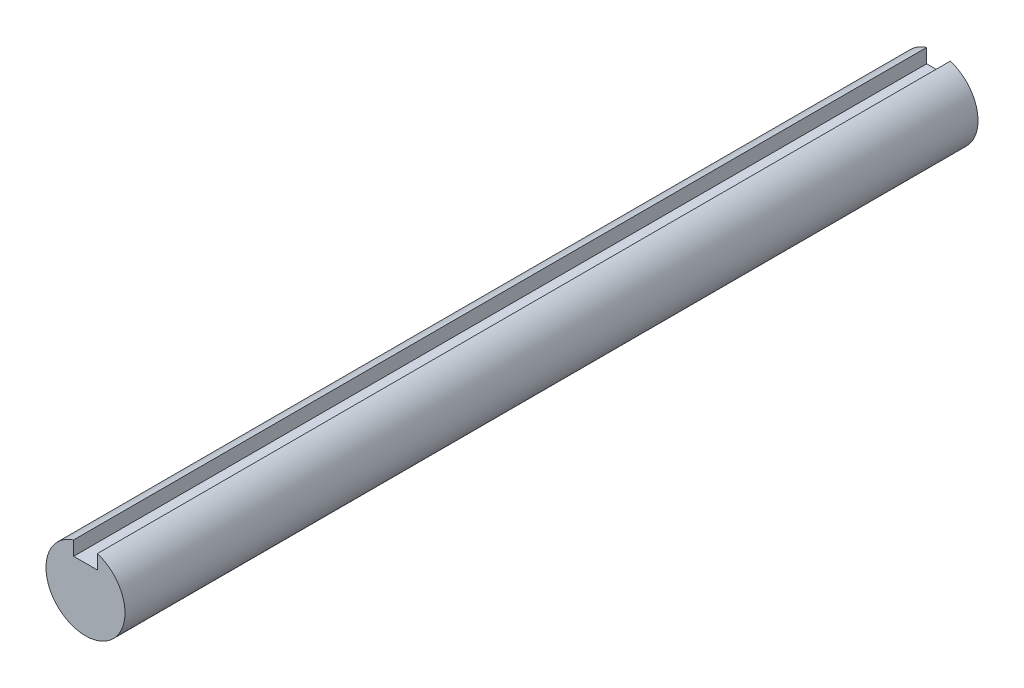
ISO-10303-21;
HEADER;
FILE_DESCRIPTION(('STEP AP214'),'2;1');
FILE_NAME('part.step','',(''),(''),'','','');
FILE_SCHEMA(('AUTOMOTIVE_DESIGN { 1 0 10303 214 1 1 1 1 }'));
ENDSEC;
DATA;
#1=APPLICATION_CONTEXT('core data for automotive mechanical design processes');
#2=APPLICATION_PROTOCOL_DEFINITION('international standard','automotive_design',2000,#1);
#3=PRODUCT_CONTEXT('',#1,'mechanical');
#4=PRODUCT('Part','Part','',(#3));
#5=PRODUCT_RELATED_PRODUCT_CATEGORY('part','',(#4));
#6=PRODUCT_DEFINITION_FORMATION('','',#4);
#7=PRODUCT_DEFINITION_CONTEXT('part definition',#1,'design');
#8=PRODUCT_DEFINITION('design','',#6,#7);
#9=PRODUCT_DEFINITION_SHAPE('','',#8);
#10=(LENGTH_UNIT() NAMED_UNIT(*) SI_UNIT(.MILLI.,.METRE.));
#11=(NAMED_UNIT(*) PLANE_ANGLE_UNIT() SI_UNIT($,.RADIAN.));
#12=(NAMED_UNIT(*) SI_UNIT($,.STERADIAN.) SOLID_ANGLE_UNIT());
#13=UNCERTAINTY_MEASURE_WITH_UNIT(LENGTH_MEASURE(1.E-05),#10,'distance_accuracy_value','');
#14=(GEOMETRIC_REPRESENTATION_CONTEXT(3) GLOBAL_UNCERTAINTY_ASSIGNED_CONTEXT((#13)) GLOBAL_UNIT_ASSIGNED_CONTEXT((#10,
#11,#12)) REPRESENTATION_CONTEXT('',''));
#15=CARTESIAN_POINT('',(0.,0.,0.));
#16=DIRECTION('',(0.,0.,1.));
#17=DIRECTION('',(1.,0.,0.));
#18=AXIS2_PLACEMENT_3D('',#15,#16,#17);
#19=CARTESIAN_POINT('',(0.,0.,53.975));
#20=DIRECTION('',(0.,0.,-1.));
#21=DIRECTION('',(-1.,0.,0.));
#22=AXIS2_PLACEMENT_3D('',#19,#20,#21);
#23=CYLINDRICAL_SURFACE('',#22,5.00000000000007);
#24=DIRECTION('',(0.,0.,-1.));
#25=VECTOR('',#24,1.);
#26=CARTESIAN_POINT('',(-1.5,4.7696960070848,53.975));
#27=LINE('',#26,#25);
#28=CARTESIAN_POINT('',(-1.5,4.7696960070848,53.975));
#29=VERTEX_POINT('',#28);
#30=CARTESIAN_POINT('',(-1.5,4.7696960070848,-53.975));
#31=VERTEX_POINT('',#30);
#32=EDGE_CURVE('E98',#29,#31,#27,.T.);
#33=ORIENTED_EDGE('',*,*,#32,.T.);
#34=CARTESIAN_POINT('',(0.,0.,-53.975));
#35=DIRECTION('',(0.,0.,1.));
#36=DIRECTION('',(1.,0.,0.));
#37=AXIS2_PLACEMENT_3D('',#34,#35,#36);
#38=CIRCLE('',#37,5.00000000000007);
#39=CARTESIAN_POINT('',(1.5,4.7696960070848,-53.975));
#40=VERTEX_POINT('',#39);
#41=EDGE_CURVE('E93',#31,#40,#38,.T.);
#42=ORIENTED_EDGE('',*,*,#41,.T.);
#43=DIRECTION('',(0.,0.,-1.));
#44=VECTOR('',#43,1.);
#45=CARTESIAN_POINT('',(1.5,4.7696960070848,53.975));
#46=LINE('',#45,#44);
#47=CARTESIAN_POINT('',(1.5,4.7696960070848,53.975));
#48=VERTEX_POINT('',#47);
#49=EDGE_CURVE('E11',#48,#40,#46,.T.);
#50=ORIENTED_EDGE('',*,*,#49,.F.);
#51=CARTESIAN_POINT('',(0.,0.,53.975));
#52=DIRECTION('',(0.,0.,1.));
#53=DIRECTION('',(1.,0.,0.));
#54=AXIS2_PLACEMENT_3D('',#51,#52,#53);
#55=CIRCLE('',#54,5.00000000000007);
#56=EDGE_CURVE('E104',#29,#48,#55,.T.);
#57=ORIENTED_EDGE('',*,*,#56,.F.);
#58=EDGE_LOOP('',(#33,#42,#50,#57));
#59=FACE_BOUND('',#58,.T.);
#60=ADVANCED_FACE('F41',(#59),#23,.T.);
#61=CARTESIAN_POINT('',(1.5,2.9696960070848,53.975));
#62=DIRECTION('',(1.,0.,0.));
#63=DIRECTION('',(0.,0.,-1.));
#64=AXIS2_PLACEMENT_3D('',#61,#62,#63);
#65=PLANE('',#64);
#66=ORIENTED_EDGE('',*,*,#49,.T.);
#67=DIRECTION('',(0.,-1.,0.));
#68=VECTOR('',#67,1.);
#69=CARTESIAN_POINT('',(1.5,2.9696960070848,-53.975));
#70=LINE('',#69,#68);
#71=CARTESIAN_POINT('',(1.5,2.9696960070848,-53.975));
#72=VERTEX_POINT('',#71);
#73=EDGE_CURVE('E83',#40,#72,#70,.T.);
#74=ORIENTED_EDGE('',*,*,#73,.T.);
#75=DIRECTION('',(0.,0.,-1.));
#76=VECTOR('',#75,1.);
#77=CARTESIAN_POINT('',(1.5,2.9696960070848,53.975));
#78=LINE('',#77,#76);
#79=CARTESIAN_POINT('',(1.5,2.9696960070848,53.975));
#80=VERTEX_POINT('',#79);
#81=EDGE_CURVE('E48',#80,#72,#78,.T.);
#82=ORIENTED_EDGE('',*,*,#81,.F.);
#83=DIRECTION('',(0.,-1.,0.));
#84=VECTOR('',#83,1.);
#85=CARTESIAN_POINT('',(1.5,2.9696960070848,53.975));
#86=LINE('',#85,#84);
#87=EDGE_CURVE('E84',#48,#80,#86,.T.);
#88=ORIENTED_EDGE('',*,*,#87,.F.);
#89=EDGE_LOOP('',(#66,#74,#82,#88));
#90=FACE_BOUND('',#89,.T.);
#91=ADVANCED_FACE('F81',(#90),#65,.F.);
#92=CARTESIAN_POINT('',(1.5,2.9696960070848,53.975));
#93=DIRECTION('',(0.,-1.,0.));
#94=DIRECTION('',(0.,0.,-1.));
#95=AXIS2_PLACEMENT_3D('',#92,#93,#94);
#96=PLANE('',#95);
#97=ORIENTED_EDGE('',*,*,#81,.T.);
#98=DIRECTION('',(-1.,0.,0.));
#99=VECTOR('',#98,1.);
#100=CARTESIAN_POINT('',(1.5,2.9696960070848,-53.975));
#101=LINE('',#100,#99);
#102=CARTESIAN_POINT('',(-1.5,2.9696960070848,-53.975));
#103=VERTEX_POINT('',#102);
#104=EDGE_CURVE('E96',#72,#103,#101,.T.);
#105=ORIENTED_EDGE('',*,*,#104,.T.);
#106=DIRECTION('',(0.,0.,-1.));
#107=VECTOR('',#106,1.);
#108=CARTESIAN_POINT('',(-1.5,2.9696960070848,53.975));
#109=LINE('',#108,#107);
#110=CARTESIAN_POINT('',(-1.5,2.9696960070848,53.975));
#111=VERTEX_POINT('',#110);
#112=EDGE_CURVE('E110',#111,#103,#109,.T.);
#113=ORIENTED_EDGE('',*,*,#112,.F.);
#114=DIRECTION('',(-1.,0.,0.));
#115=VECTOR('',#114,1.);
#116=CARTESIAN_POINT('',(1.5,2.9696960070848,53.975));
#117=LINE('',#116,#115);
#118=EDGE_CURVE('E60',#80,#111,#117,.T.);
#119=ORIENTED_EDGE('',*,*,#118,.F.);
#120=EDGE_LOOP('',(#97,#105,#113,#119));
#121=FACE_BOUND('',#120,.T.);
#122=ADVANCED_FACE('F112',(#121),#96,.F.);
#123=CARTESIAN_POINT('',(-1.5,2.9696960070848,53.975));
#124=DIRECTION('',(-1.,0.,0.));
#125=DIRECTION('',(0.,0.,1.));
#126=AXIS2_PLACEMENT_3D('',#123,#124,#125);
#127=PLANE('',#126);
#128=ORIENTED_EDGE('',*,*,#112,.T.);
#129=DIRECTION('',(0.,1.,0.));
#130=VECTOR('',#129,1.);
#131=CARTESIAN_POINT('',(-1.5,2.9696960070848,-53.975));
#132=LINE('',#131,#130);
#133=EDGE_CURVE('E102',#103,#31,#132,.T.);
#134=ORIENTED_EDGE('',*,*,#133,.T.);
#135=ORIENTED_EDGE('',*,*,#32,.F.);
#136=DIRECTION('',(0.,1.,0.));
#137=VECTOR('',#136,1.);
#138=CARTESIAN_POINT('',(-1.5,2.9696960070848,53.975));
#139=LINE('',#138,#137);
#140=EDGE_CURVE('E55',#111,#29,#139,.T.);
#141=ORIENTED_EDGE('',*,*,#140,.F.);
#142=EDGE_LOOP('',(#128,#134,#135,#141));
#143=FACE_BOUND('',#142,.T.);
#144=ADVANCED_FACE('F114',(#143),#127,.F.);
#145=CARTESIAN_POINT('',(0.,0.,53.975));
#146=DIRECTION('',(0.,0.,1.));
#147=DIRECTION('',(1.,0.,0.));
#148=AXIS2_PLACEMENT_3D('',#145,#146,#147);
#149=PLANE('',#148);
#150=ORIENTED_EDGE('',*,*,#56,.T.);
#151=ORIENTED_EDGE('',*,*,#87,.T.);
#152=ORIENTED_EDGE('',*,*,#118,.T.);
#153=ORIENTED_EDGE('',*,*,#140,.T.);
#154=EDGE_LOOP('',(#150,#151,#152,#153));
#155=FACE_BOUND('',#154,.T.);
#156=ADVANCED_FACE('F115',(#155),#149,.T.);
#157=CARTESIAN_POINT('',(0.,0.,-53.975));
#158=DIRECTION('',(0.,0.,1.));
#159=DIRECTION('',(1.,0.,0.));
#160=AXIS2_PLACEMENT_3D('',#157,#158,#159);
#161=PLANE('',#160);
#162=ORIENTED_EDGE('',*,*,#41,.F.);
#163=ORIENTED_EDGE('',*,*,#133,.F.);
#164=ORIENTED_EDGE('',*,*,#104,.F.);
#165=ORIENTED_EDGE('',*,*,#73,.F.);
#166=EDGE_LOOP('',(#162,#163,#164,#165));
#167=FACE_BOUND('',#166,.T.);
#168=ADVANCED_FACE('F91',(#167),#161,.F.);
#169=CLOSED_SHELL('',(#60,#91,#122,#144,#156,#168));
#170=MANIFOLD_SOLID_BREP('B2',#169);
#171=ADVANCED_BREP_SHAPE_REPRESENTATION('',(#18,#170),#14);
#172=SHAPE_DEFINITION_REPRESENTATION(#9,#171);
ENDSEC;
END-ISO-10303-21;
